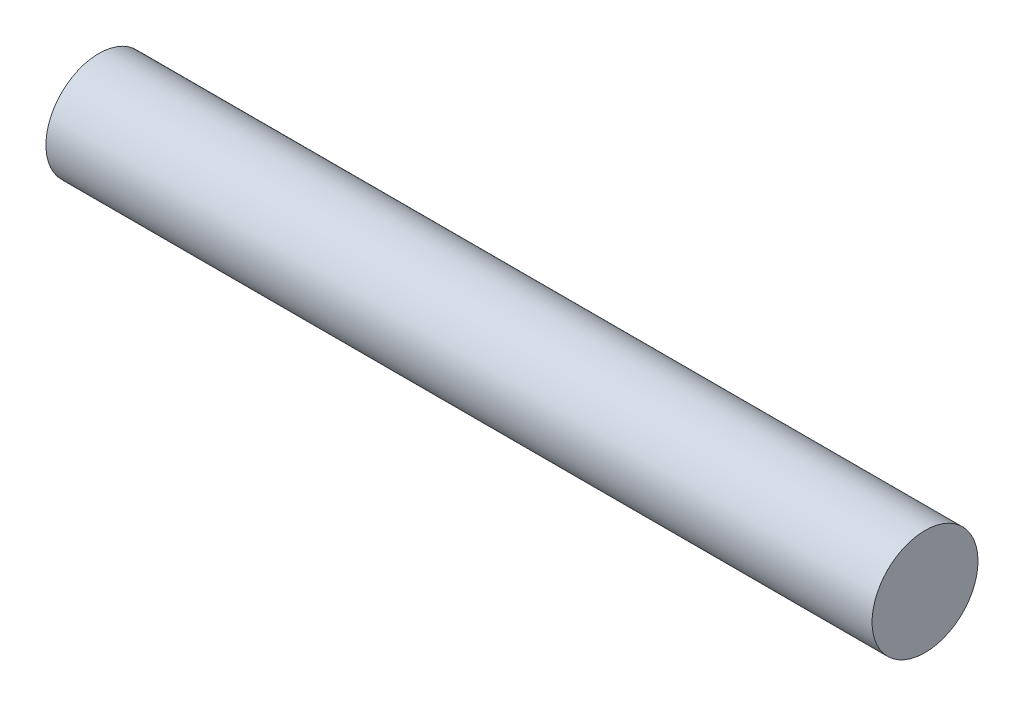
ISO-10303-21;
HEADER;
FILE_DESCRIPTION(('STEP AP214'),'2;1');
FILE_NAME('part.step','',(''),(''),'','','');
FILE_SCHEMA(('AUTOMOTIVE_DESIGN { 1 0 10303 214 1 1 1 1 }'));
ENDSEC;
DATA;
#1=APPLICATION_CONTEXT('core data for automotive mechanical design processes');
#2=APPLICATION_PROTOCOL_DEFINITION('international standard','automotive_design',2000,#1);
#3=PRODUCT_CONTEXT('',#1,'mechanical');
#4=PRODUCT('Part','Part','',(#3));
#5=PRODUCT_RELATED_PRODUCT_CATEGORY('part','',(#4));
#6=PRODUCT_DEFINITION_FORMATION('','',#4);
#7=PRODUCT_DEFINITION_CONTEXT('part definition',#1,'design');
#8=PRODUCT_DEFINITION('design','',#6,#7);
#9=PRODUCT_DEFINITION_SHAPE('','',#8);
#10=(LENGTH_UNIT() NAMED_UNIT(*) SI_UNIT(.MILLI.,.METRE.));
#11=(NAMED_UNIT(*) PLANE_ANGLE_UNIT() SI_UNIT($,.RADIAN.));
#12=(NAMED_UNIT(*) SI_UNIT($,.STERADIAN.) SOLID_ANGLE_UNIT());
#13=UNCERTAINTY_MEASURE_WITH_UNIT(LENGTH_MEASURE(1.E-05),#10,'distance_accuracy_value','');
#14=(GEOMETRIC_REPRESENTATION_CONTEXT(3) GLOBAL_UNCERTAINTY_ASSIGNED_CONTEXT((#13)) GLOBAL_UNIT_ASSIGNED_CONTEXT((#10,
#11,#12)) REPRESENTATION_CONTEXT('',''));
#15=CARTESIAN_POINT('',(0.,0.,0.));
#16=DIRECTION('',(0.,0.,1.));
#17=DIRECTION('',(1.,0.,0.));
#18=AXIS2_PLACEMENT_3D('',#15,#16,#17);
#19=CARTESIAN_POINT('',(198.12,0.,0.));
#20=DIRECTION('',(-1.,0.,0.));
#21=DIRECTION('',(0.,0.,1.));
#22=AXIS2_PLACEMENT_3D('',#19,#20,#21);
#23=CYLINDRICAL_SURFACE('',#22,12.7);
#24=CARTESIAN_POINT('',(198.12,0.,0.));
#25=DIRECTION('',(1.,0.,0.));
#26=DIRECTION('',(0.,0.,-1.));
#27=AXIS2_PLACEMENT_3D('',#24,#25,#26);
#28=CIRCLE('',#27,12.7);
#29=CARTESIAN_POINT('',(198.12,0.,-12.7));
#30=VERTEX_POINT('',#29);
#31=EDGE_CURVE('E10',#30,#30,#28,.T.);
#32=ORIENTED_EDGE('',*,*,#31,.F.);
#33=EDGE_LOOP('',(#32));
#34=FACE_BOUND('',#33,.T.);
#35=CARTESIAN_POINT('',(0.,0.,0.));
#36=DIRECTION('',(1.,0.,0.));
#37=DIRECTION('',(0.,0.,-1.));
#38=AXIS2_PLACEMENT_3D('',#35,#36,#37);
#39=CIRCLE('',#38,12.7);
#40=CARTESIAN_POINT('',(0.,0.,-12.7));
#41=VERTEX_POINT('',#40);
#42=EDGE_CURVE('E34',#41,#41,#39,.T.);
#43=ORIENTED_EDGE('',*,*,#42,.T.);
#44=EDGE_LOOP('',(#43));
#45=FACE_BOUND('',#44,.T.);
#46=ADVANCED_FACE('F31',(#34,#45),#23,.T.);
#47=CARTESIAN_POINT('',(198.12,0.,0.));
#48=DIRECTION('',(1.,0.,0.));
#49=DIRECTION('',(0.,0.,-1.));
#50=AXIS2_PLACEMENT_3D('',#47,#48,#49);
#51=PLANE('',#50);
#52=ORIENTED_EDGE('',*,*,#31,.T.);
#53=EDGE_LOOP('',(#52));
#54=FACE_BOUND('',#53,.T.);
#55=ADVANCED_FACE('F46',(#54),#51,.T.);
#56=CARTESIAN_POINT('',(0.,0.,0.));
#57=DIRECTION('',(1.,0.,0.));
#58=DIRECTION('',(0.,0.,-1.));
#59=AXIS2_PLACEMENT_3D('',#56,#57,#58);
#60=PLANE('',#59);
#61=ORIENTED_EDGE('',*,*,#42,.F.);
#62=EDGE_LOOP('',(#61));
#63=FACE_BOUND('',#62,.T.);
#64=ADVANCED_FACE('F44',(#63),#60,.F.);
#65=CLOSED_SHELL('',(#46,#55,#64));
#66=MANIFOLD_SOLID_BREP('B2',#65);
#67=ADVANCED_BREP_SHAPE_REPRESENTATION('',(#18,#66),#14);
#68=SHAPE_DEFINITION_REPRESENTATION(#9,#67);
ENDSEC;
END-ISO-10303-21;
